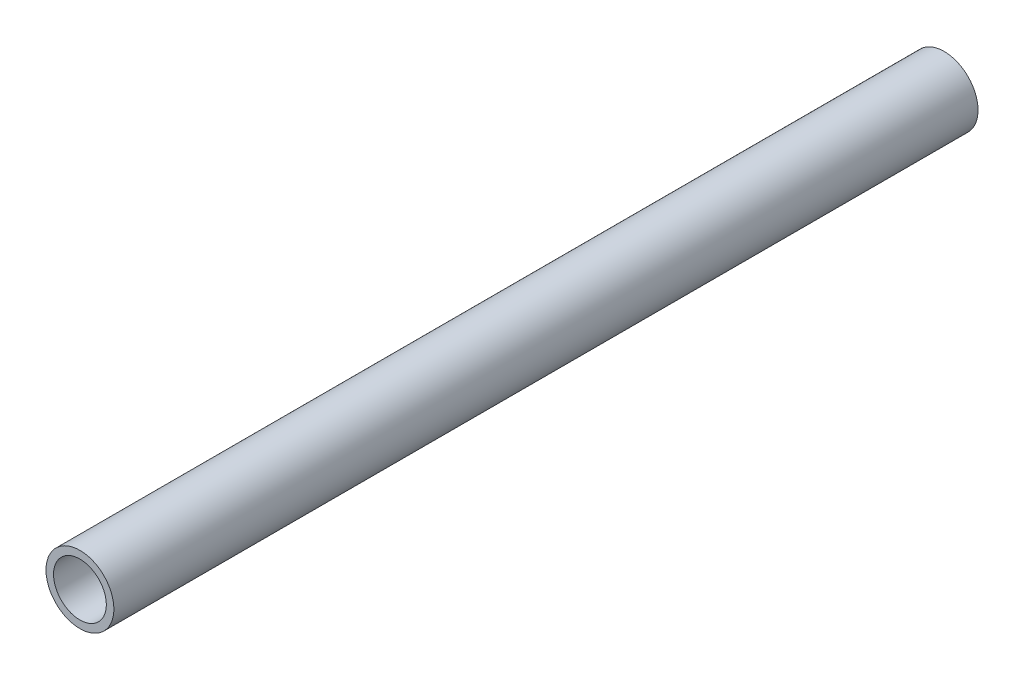
ISO-10303-21;
HEADER;
FILE_DESCRIPTION(('STEP AP214'),'2;1');
FILE_NAME('part.step','',(''),(''),'','','');
FILE_SCHEMA(('AUTOMOTIVE_DESIGN { 1 0 10303 214 1 1 1 1 }'));
ENDSEC;
DATA;
#1=APPLICATION_CONTEXT('core data for automotive mechanical design processes');
#2=APPLICATION_PROTOCOL_DEFINITION('international standard','automotive_design',2000,#1);
#3=PRODUCT_CONTEXT('',#1,'mechanical');
#4=PRODUCT('Part','Part','',(#3));
#5=PRODUCT_RELATED_PRODUCT_CATEGORY('part','',(#4));
#6=PRODUCT_DEFINITION_FORMATION('','',#4);
#7=PRODUCT_DEFINITION_CONTEXT('part definition',#1,'design');
#8=PRODUCT_DEFINITION('design','',#6,#7);
#9=PRODUCT_DEFINITION_SHAPE('','',#8);
#10=(LENGTH_UNIT() NAMED_UNIT(*) SI_UNIT(.MILLI.,.METRE.));
#11=(NAMED_UNIT(*) PLANE_ANGLE_UNIT() SI_UNIT($,.RADIAN.));
#12=(NAMED_UNIT(*) SI_UNIT($,.STERADIAN.) SOLID_ANGLE_UNIT());
#13=UNCERTAINTY_MEASURE_WITH_UNIT(LENGTH_MEASURE(1.E-05),#10,'distance_accuracy_value','');
#14=(GEOMETRIC_REPRESENTATION_CONTEXT(3) GLOBAL_UNCERTAINTY_ASSIGNED_CONTEXT((#13)) GLOBAL_UNIT_ASSIGNED_CONTEXT((#10,
#11,#12)) REPRESENTATION_CONTEXT('',''));
#15=CARTESIAN_POINT('',(0.,0.,0.));
#16=DIRECTION('',(0.,0.,1.));
#17=DIRECTION('',(1.,0.,0.));
#18=AXIS2_PLACEMENT_3D('',#15,#16,#17);
#19=CARTESIAN_POINT('',(0.,0.,-229.2769));
#20=DIRECTION('',(0.,0.,-1.));
#21=DIRECTION('',(1.,0.,0.));
#22=AXIS2_PLACEMENT_3D('',#19,#20,#21);
#23=PLANE('',#22);
#24=CARTESIAN_POINT('',(0.,0.,-229.2769));
#25=DIRECTION('',(0.,0.,1.));
#26=DIRECTION('',(1.,0.,0.));
#27=AXIS2_PLACEMENT_3D('',#24,#25,#26);
#28=CIRCLE('',#27,9.);
#29=CARTESIAN_POINT('',(-9.,0.,-229.2769));
#30=VERTEX_POINT('',#29);
#31=EDGE_CURVE('E10',#30,#30,#28,.T.);
#32=ORIENTED_EDGE('',*,*,#31,.F.);
#33=EDGE_LOOP('',(#32));
#34=FACE_BOUND('',#33,.T.);
#35=CARTESIAN_POINT('',(0.,0.,-229.2769));
#36=DIRECTION('',(0.,0.,1.));
#37=DIRECTION('',(1.,0.,0.));
#38=AXIS2_PLACEMENT_3D('',#35,#36,#37);
#39=CIRCLE('',#38,7.);
#40=CARTESIAN_POINT('',(-7.,0.,-229.2769));
#41=VERTEX_POINT('',#40);
#42=EDGE_CURVE('E44',#41,#41,#39,.T.);
#43=ORIENTED_EDGE('',*,*,#42,.T.);
#44=EDGE_LOOP('',(#43));
#45=FACE_BOUND('',#44,.T.);
#46=ADVANCED_FACE('F33',(#34,#45),#23,.T.);
#47=CARTESIAN_POINT('',(0.,0.,0.));
#48=DIRECTION('',(0.,0.,-1.));
#49=DIRECTION('',(1.,0.,0.));
#50=AXIS2_PLACEMENT_3D('',#47,#48,#49);
#51=PLANE('',#50);
#52=CARTESIAN_POINT('',(0.,0.,0.));
#53=DIRECTION('',(0.,0.,1.));
#54=DIRECTION('',(1.,0.,0.));
#55=AXIS2_PLACEMENT_3D('',#52,#53,#54);
#56=CIRCLE('',#55,9.);
#57=CARTESIAN_POINT('',(-9.,0.,0.));
#58=VERTEX_POINT('',#57);
#59=EDGE_CURVE('E37',#58,#58,#56,.T.);
#60=ORIENTED_EDGE('',*,*,#59,.T.);
#61=EDGE_LOOP('',(#60));
#62=FACE_BOUND('',#61,.T.);
#63=CARTESIAN_POINT('',(0.,0.,0.));
#64=DIRECTION('',(0.,0.,1.));
#65=DIRECTION('',(1.,0.,0.));
#66=AXIS2_PLACEMENT_3D('',#63,#64,#65);
#67=CIRCLE('',#66,7.);
#68=CARTESIAN_POINT('',(-7.,0.,0.));
#69=VERTEX_POINT('',#68);
#70=EDGE_CURVE('E46',#69,#69,#67,.T.);
#71=ORIENTED_EDGE('',*,*,#70,.F.);
#72=EDGE_LOOP('',(#71));
#73=FACE_BOUND('',#72,.T.);
#74=ADVANCED_FACE('F59',(#62,#73),#51,.F.);
#75=CARTESIAN_POINT('',(0.,0.,-229.2769));
#76=DIRECTION('',(0.,0.,1.));
#77=DIRECTION('',(-1.,0.,0.));
#78=AXIS2_PLACEMENT_3D('',#75,#76,#77);
#79=CYLINDRICAL_SURFACE('',#78,9.);
#80=CARTESIAN_POINT('',(-9.,0.,-229.2769));
#81=CARTESIAN_POINT('',(-9.,0.,-226.888598958333));
#82=CARTESIAN_POINT('',(-9.,0.,-224.500297916667));
#83=CARTESIAN_POINT('',(-9.,0.,-219.723695833333));
#84=CARTESIAN_POINT('',(-9.,0.,-217.335394791667));
#85=CARTESIAN_POINT('',(-9.,0.,-212.558792708333));
#86=CARTESIAN_POINT('',(-9.,0.,-210.170491666667));
#87=CARTESIAN_POINT('',(-9.,0.,-205.393889583333));
#88=CARTESIAN_POINT('',(-9.,0.,-203.005588541667));
#89=CARTESIAN_POINT('',(-9.,0.,-198.228986458333));
#90=CARTESIAN_POINT('',(-9.,0.,-195.840685416667));
#91=CARTESIAN_POINT('',(-9.,0.,-191.064083333333));
#92=CARTESIAN_POINT('',(-9.,0.,-188.675782291667));
#93=CARTESIAN_POINT('',(-9.,0.,-183.899180208333));
#94=CARTESIAN_POINT('',(-9.,0.,-181.510879166667));
#95=CARTESIAN_POINT('',(-9.,0.,-176.734277083333));
#96=CARTESIAN_POINT('',(-9.,0.,-174.345976041667));
#97=CARTESIAN_POINT('',(-9.,0.,-169.569373958333));
#98=CARTESIAN_POINT('',(-9.,0.,-167.181072916667));
#99=CARTESIAN_POINT('',(-9.,0.,-162.404470833333));
#100=CARTESIAN_POINT('',(-9.,0.,-160.016169791667));
#101=CARTESIAN_POINT('',(-9.,0.,-155.239567708333));
#102=CARTESIAN_POINT('',(-9.,0.,-152.851266666667));
#103=CARTESIAN_POINT('',(-9.,0.,-148.074664583333));
#104=CARTESIAN_POINT('',(-9.,0.,-145.686363541667));
#105=CARTESIAN_POINT('',(-9.,0.,-140.909761458333));
#106=CARTESIAN_POINT('',(-9.,0.,-138.521460416667));
#107=CARTESIAN_POINT('',(-9.,0.,-133.744858333333));
#108=CARTESIAN_POINT('',(-9.,0.,-131.356557291667));
#109=CARTESIAN_POINT('',(-9.,0.,-126.579955208333));
#110=CARTESIAN_POINT('',(-9.,0.,-124.191654166667));
#111=CARTESIAN_POINT('',(-9.,0.,-119.415052083333));
#112=CARTESIAN_POINT('',(-9.,0.,-117.026751041667));
#113=CARTESIAN_POINT('',(-9.,0.,-112.250148958333));
#114=CARTESIAN_POINT('',(-9.,0.,-109.861847916667));
#115=CARTESIAN_POINT('',(-9.,0.,-105.085245833333));
#116=CARTESIAN_POINT('',(-9.,0.,-102.696944791667));
#117=CARTESIAN_POINT('',(-9.,0.,-97.9203427083334));
#118=CARTESIAN_POINT('',(-9.,0.,-95.5320416666667));
#119=CARTESIAN_POINT('',(-9.,0.,-90.7554395833334));
#120=CARTESIAN_POINT('',(-9.,0.,-88.3671385416667));
#121=CARTESIAN_POINT('',(-9.,0.,-83.5905364583334));
#122=CARTESIAN_POINT('',(-9.,0.,-81.2022354166667));
#123=CARTESIAN_POINT('',(-9.,0.,-76.4256333333334));
#124=CARTESIAN_POINT('',(-9.,0.,-74.0373322916667));
#125=CARTESIAN_POINT('',(-9.,0.,-69.2607302083334));
#126=CARTESIAN_POINT('',(-9.,0.,-66.8724291666667));
#127=CARTESIAN_POINT('',(-9.,0.,-62.0958270833334));
#128=CARTESIAN_POINT('',(-9.,0.,-59.7075260416667));
#129=CARTESIAN_POINT('',(-9.,0.,-54.9309239583334));
#130=CARTESIAN_POINT('',(-9.,0.,-52.5426229166667));
#131=CARTESIAN_POINT('',(-9.,0.,-47.7660208333334));
#132=CARTESIAN_POINT('',(-9.,0.,-45.3777197916667));
#133=CARTESIAN_POINT('',(-9.,0.,-40.6011177083334));
#134=CARTESIAN_POINT('',(-9.,0.,-38.2128166666667));
#135=CARTESIAN_POINT('',(-9.,0.,-33.4362145833334));
#136=CARTESIAN_POINT('',(-9.,0.,-31.0479135416667));
#137=CARTESIAN_POINT('',(-9.,0.,-26.2713114583334));
#138=CARTESIAN_POINT('',(-9.,0.,-23.8830104166667));
#139=CARTESIAN_POINT('',(-9.,0.,-19.1064083333334));
#140=CARTESIAN_POINT('',(-9.,0.,-16.7181072916667));
#141=CARTESIAN_POINT('',(-9.,0.,-11.9415052083334));
#142=CARTESIAN_POINT('',(-9.,0.,-9.5532041666667));
#143=CARTESIAN_POINT('',(-9.,0.,-4.77660208333337));
#144=CARTESIAN_POINT('',(-9.,0.,-2.3883010416667));
#145=CARTESIAN_POINT('',(-9.,0.,0.));
#146=B_SPLINE_CURVE_WITH_KNOTS('',3,(#80,#81,#82,#83,#84,#85,#86,#87,#88,#89,#90,#91,#92,#93,
#94,#95,#96,#97,#98,#99,#100,#101,#102,#103,#104,#105,#106,#107,#108,#109,#110,#111,#112,#113,
#114,#115,#116,#117,#118,#119,#120,#121,#122,#123,#124,#125,#126,#127,#128,#129,#130,#131,#132,
#133,#134,#135,#136,#137,#138,#139,#140,#141,#142,#143,#144,#145),.UNSPECIFIED.,.F.,.F.,(4,2,2,
2,2,2,2,2,2,2,2,2,2,2,2,2,2,2,2,2,2,2,2,2,2,2,2,2,2,2,2,2,4),(0.,7.16490312500001,14.32980625,
21.494709375,28.6596125,35.824515625,42.98941875,50.154321875,57.319225,64.484128125,
71.64903125,78.813934375,85.9788375,93.143740625,100.30864375,107.473546875,114.63845,
121.803353125,128.96825625,136.133159375,143.2980625,150.462965625,157.62786875,164.792771875,
171.957675,179.122578125,186.28748125,193.452384375,200.6172875,207.782190625,214.94709375,
222.111996875,229.2769),.UNSPECIFIED.);
#147=EDGE_CURVE('BSEAM35',#30,#58,#146,.T.);
#148=ORIENTED_EDGE('',*,*,#31,.T.);
#149=ORIENTED_EDGE('',*,*,#59,.F.);
#150=ORIENTED_EDGE('',*,*,#147,.T.);
#151=ORIENTED_EDGE('',*,*,#147,.F.);
#152=EDGE_LOOP('',(#148,#150,#149,#151));
#153=FACE_BOUND('',#152,.T.);
#154=ADVANCED_FACE('F35',(#153),#79,.T.);
#155=CARTESIAN_POINT('',(0.,0.,-229.2769));
#156=DIRECTION('',(0.,0.,1.));
#157=DIRECTION('',(-1.,0.,0.));
#158=AXIS2_PLACEMENT_3D('',#155,#156,#157);
#159=CYLINDRICAL_SURFACE('',#158,7.);
#160=CARTESIAN_POINT('',(-7.,0.,-229.2769));
#161=CARTESIAN_POINT('',(-7.,0.,-226.888598958333));
#162=CARTESIAN_POINT('',(-7.,0.,-224.500297916667));
#163=CARTESIAN_POINT('',(-7.,0.,-219.723695833333));
#164=CARTESIAN_POINT('',(-7.,0.,-217.335394791667));
#165=CARTESIAN_POINT('',(-7.,0.,-212.558792708333));
#166=CARTESIAN_POINT('',(-7.,0.,-210.170491666667));
#167=CARTESIAN_POINT('',(-7.,0.,-205.393889583333));
#168=CARTESIAN_POINT('',(-7.,0.,-203.005588541667));
#169=CARTESIAN_POINT('',(-7.,0.,-198.228986458333));
#170=CARTESIAN_POINT('',(-7.,0.,-195.840685416667));
#171=CARTESIAN_POINT('',(-7.,0.,-191.064083333333));
#172=CARTESIAN_POINT('',(-7.,0.,-188.675782291667));
#173=CARTESIAN_POINT('',(-7.,0.,-183.899180208333));
#174=CARTESIAN_POINT('',(-7.,0.,-181.510879166667));
#175=CARTESIAN_POINT('',(-7.,0.,-176.734277083333));
#176=CARTESIAN_POINT('',(-7.,0.,-174.345976041667));
#177=CARTESIAN_POINT('',(-7.,0.,-169.569373958333));
#178=CARTESIAN_POINT('',(-7.,0.,-167.181072916667));
#179=CARTESIAN_POINT('',(-7.,0.,-162.404470833333));
#180=CARTESIAN_POINT('',(-7.,0.,-160.016169791667));
#181=CARTESIAN_POINT('',(-7.,0.,-155.239567708333));
#182=CARTESIAN_POINT('',(-7.,0.,-152.851266666667));
#183=CARTESIAN_POINT('',(-7.,0.,-148.074664583333));
#184=CARTESIAN_POINT('',(-7.,0.,-145.686363541667));
#185=CARTESIAN_POINT('',(-7.,0.,-140.909761458333));
#186=CARTESIAN_POINT('',(-7.,0.,-138.521460416667));
#187=CARTESIAN_POINT('',(-7.,0.,-133.744858333333));
#188=CARTESIAN_POINT('',(-7.,0.,-131.356557291667));
#189=CARTESIAN_POINT('',(-7.,0.,-126.579955208333));
#190=CARTESIAN_POINT('',(-7.,0.,-124.191654166667));
#191=CARTESIAN_POINT('',(-7.,0.,-119.415052083333));
#192=CARTESIAN_POINT('',(-7.,0.,-117.026751041667));
#193=CARTESIAN_POINT('',(-7.,0.,-112.250148958333));
#194=CARTESIAN_POINT('',(-7.,0.,-109.861847916667));
#195=CARTESIAN_POINT('',(-7.,0.,-105.085245833333));
#196=CARTESIAN_POINT('',(-7.,0.,-102.696944791667));
#197=CARTESIAN_POINT('',(-7.,0.,-97.9203427083334));
#198=CARTESIAN_POINT('',(-7.,0.,-95.5320416666667));
#199=CARTESIAN_POINT('',(-7.,0.,-90.7554395833334));
#200=CARTESIAN_POINT('',(-7.,0.,-88.3671385416667));
#201=CARTESIAN_POINT('',(-7.,0.,-83.5905364583334));
#202=CARTESIAN_POINT('',(-7.,0.,-81.2022354166667));
#203=CARTESIAN_POINT('',(-7.,0.,-76.4256333333334));
#204=CARTESIAN_POINT('',(-7.,0.,-74.0373322916667));
#205=CARTESIAN_POINT('',(-7.,0.,-69.2607302083334));
#206=CARTESIAN_POINT('',(-7.,0.,-66.8724291666667));
#207=CARTESIAN_POINT('',(-7.,0.,-62.0958270833334));
#208=CARTESIAN_POINT('',(-7.,0.,-59.7075260416667));
#209=CARTESIAN_POINT('',(-7.,0.,-54.9309239583334));
#210=CARTESIAN_POINT('',(-7.,0.,-52.5426229166667));
#211=CARTESIAN_POINT('',(-7.,0.,-47.7660208333334));
#212=CARTESIAN_POINT('',(-7.,0.,-45.3777197916667));
#213=CARTESIAN_POINT('',(-7.,0.,-40.6011177083334));
#214=CARTESIAN_POINT('',(-7.,0.,-38.2128166666667));
#215=CARTESIAN_POINT('',(-7.,0.,-33.4362145833334));
#216=CARTESIAN_POINT('',(-7.,0.,-31.0479135416667));
#217=CARTESIAN_POINT('',(-7.,0.,-26.2713114583334));
#218=CARTESIAN_POINT('',(-7.,0.,-23.8830104166667));
#219=CARTESIAN_POINT('',(-7.,0.,-19.1064083333334));
#220=CARTESIAN_POINT('',(-7.,0.,-16.7181072916667));
#221=CARTESIAN_POINT('',(-7.,0.,-11.9415052083334));
#222=CARTESIAN_POINT('',(-7.,0.,-9.5532041666667));
#223=CARTESIAN_POINT('',(-7.,0.,-4.77660208333337));
#224=CARTESIAN_POINT('',(-7.,0.,-2.3883010416667));
#225=CARTESIAN_POINT('',(-7.,0.,0.));
#226=B_SPLINE_CURVE_WITH_KNOTS('',3,(#160,#161,#162,#163,#164,#165,#166,#167,#168,#169,#170,
#171,#172,#173,#174,#175,#176,#177,#178,#179,#180,#181,#182,#183,#184,#185,#186,#187,#188,#189,
#190,#191,#192,#193,#194,#195,#196,#197,#198,#199,#200,#201,#202,#203,#204,#205,#206,#207,#208,
#209,#210,#211,#212,#213,#214,#215,#216,#217,#218,#219,#220,#221,#222,#223,#224,#225),
.UNSPECIFIED.,.F.,.F.,(4,2,2,2,2,2,2,2,2,2,2,2,2,2,2,2,2,2,2,2,2,2,2,2,2,2,2,2,2,2,2,2,4),(0.,
7.16490312500001,14.32980625,21.494709375,28.6596125,35.824515625,42.98941875,50.154321875,
57.319225,64.484128125,71.64903125,78.813934375,85.9788375,93.143740625,100.30864375,
107.473546875,114.63845,121.803353125,128.96825625,136.133159375,143.2980625,150.462965625,
157.62786875,164.792771875,171.957675,179.122578125,186.28748125,193.452384375,200.6172875,
207.782190625,214.94709375,222.111996875,229.2769),.UNSPECIFIED.);
#227=EDGE_CURVE('BSEAM53',#41,#69,#226,.T.);
#228=ORIENTED_EDGE('',*,*,#42,.F.);
#229=ORIENTED_EDGE('',*,*,#70,.T.);
#230=ORIENTED_EDGE('',*,*,#227,.T.);
#231=ORIENTED_EDGE('',*,*,#227,.F.);
#232=EDGE_LOOP('',(#228,#230,#229,#231));
#233=FACE_BOUND('',#232,.T.);
#234=ADVANCED_FACE('F53',(#233),#159,.F.);
#235=CLOSED_SHELL('',(#46,#74,#154,#234));
#236=MANIFOLD_SOLID_BREP('B2',#235);
#237=ADVANCED_BREP_SHAPE_REPRESENTATION('',(#18,#236),#14);
#238=SHAPE_DEFINITION_REPRESENTATION(#9,#237);
ENDSEC;
END-ISO-10303-21;
